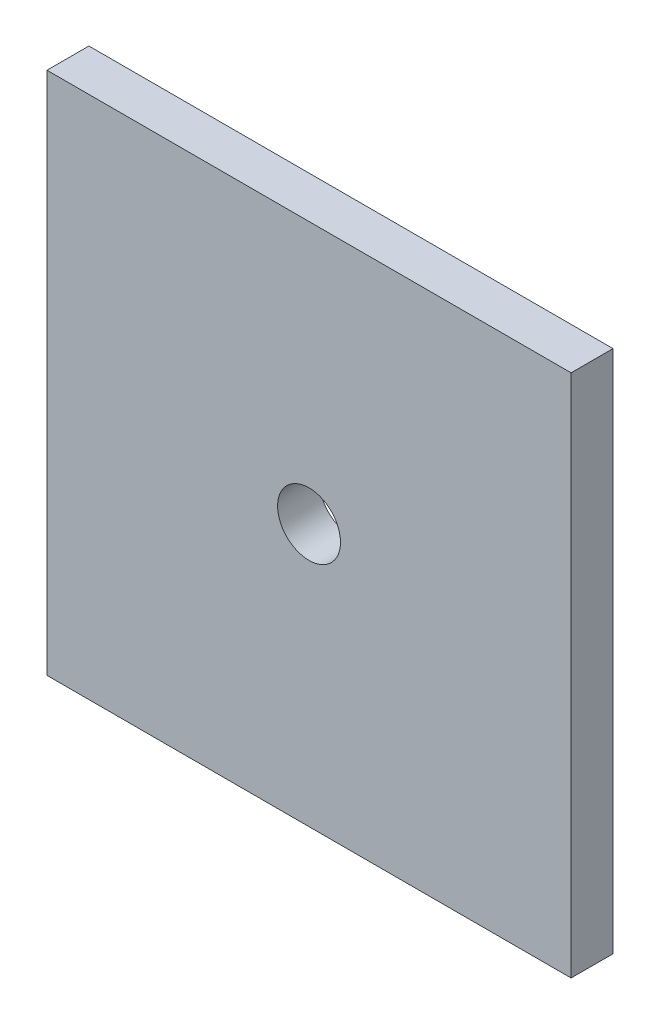
ISO-10303-21;
HEADER;
FILE_DESCRIPTION(('STEP AP214'),'2;1');
FILE_NAME('part.step','',(''),(''),'','','');
FILE_SCHEMA(('AUTOMOTIVE_DESIGN { 1 0 10303 214 1 1 1 1 }'));
ENDSEC;
DATA;
#1=APPLICATION_CONTEXT('core data for automotive mechanical design processes');
#2=APPLICATION_PROTOCOL_DEFINITION('international standard','automotive_design',2000,#1);
#3=PRODUCT_CONTEXT('',#1,'mechanical');
#4=PRODUCT('Part','Part','',(#3));
#5=PRODUCT_RELATED_PRODUCT_CATEGORY('part','',(#4));
#6=PRODUCT_DEFINITION_FORMATION('','',#4);
#7=PRODUCT_DEFINITION_CONTEXT('part definition',#1,'design');
#8=PRODUCT_DEFINITION('design','',#6,#7);
#9=PRODUCT_DEFINITION_SHAPE('','',#8);
#10=(LENGTH_UNIT() NAMED_UNIT(*) SI_UNIT(.MILLI.,.METRE.));
#11=(NAMED_UNIT(*) PLANE_ANGLE_UNIT() SI_UNIT($,.RADIAN.));
#12=(NAMED_UNIT(*) SI_UNIT($,.STERADIAN.) SOLID_ANGLE_UNIT());
#13=UNCERTAINTY_MEASURE_WITH_UNIT(LENGTH_MEASURE(1.E-05),#10,'distance_accuracy_value','');
#14=(GEOMETRIC_REPRESENTATION_CONTEXT(3) GLOBAL_UNCERTAINTY_ASSIGNED_CONTEXT((#13)) GLOBAL_UNIT_ASSIGNED_CONTEXT((#10,
#11,#12)) REPRESENTATION_CONTEXT('',''));
#15=CARTESIAN_POINT('',(0.,0.,0.));
#16=DIRECTION('',(0.,0.,1.));
#17=DIRECTION('',(1.,0.,0.));
#18=AXIS2_PLACEMENT_3D('',#15,#16,#17);
#19=CARTESIAN_POINT('',(0.,0.,3.));
#20=DIRECTION('',(0.,0.,-1.));
#21=DIRECTION('',(-1.,0.,0.));
#22=AXIS2_PLACEMENT_3D('',#19,#20,#21);
#23=PLANE('',#22);
#24=DIRECTION('',(0.,1.,0.));
#25=VECTOR('',#24,1.);
#26=CARTESIAN_POINT('',(18.75,-18.75,3.));
#27=LINE('',#26,#25);
#28=CARTESIAN_POINT('',(18.75,-18.75,3.));
#29=VERTEX_POINT('',#28);
#30=CARTESIAN_POINT('',(18.75,18.75,3.));
#31=VERTEX_POINT('',#30);
#32=EDGE_CURVE('E89',#29,#31,#27,.T.);
#33=ORIENTED_EDGE('',*,*,#32,.T.);
#34=DIRECTION('',(-1.,0.,0.));
#35=VECTOR('',#34,1.);
#36=CARTESIAN_POINT('',(-18.75,18.75,3.));
#37=LINE('',#36,#35);
#38=CARTESIAN_POINT('',(-18.75,18.75,3.));
#39=VERTEX_POINT('',#38);
#40=EDGE_CURVE('E84',#31,#39,#37,.T.);
#41=ORIENTED_EDGE('',*,*,#40,.T.);
#42=DIRECTION('',(0.,-1.,0.));
#43=VECTOR('',#42,1.);
#44=CARTESIAN_POINT('',(-18.75,-18.75,3.));
#45=LINE('',#44,#43);
#46=CARTESIAN_POINT('',(-18.75,-18.75,3.));
#47=VERTEX_POINT('',#46);
#48=EDGE_CURVE('E87',#39,#47,#45,.T.);
#49=ORIENTED_EDGE('',*,*,#48,.T.);
#50=DIRECTION('',(1.,0.,0.));
#51=VECTOR('',#50,1.);
#52=CARTESIAN_POINT('',(-18.75,-18.75,3.));
#53=LINE('',#52,#51);
#54=EDGE_CURVE('E54',#47,#29,#53,.T.);
#55=ORIENTED_EDGE('',*,*,#54,.T.);
#56=EDGE_LOOP('',(#33,#41,#49,#55));
#57=FACE_BOUND('',#56,.T.);
#58=CARTESIAN_POINT('',(0.,0.,3.));
#59=DIRECTION('',(0.,0.,1.));
#60=DIRECTION('',(1.,0.,0.));
#61=AXIS2_PLACEMENT_3D('',#58,#59,#60);
#62=CIRCLE('',#61,2.25);
#63=CARTESIAN_POINT('',(2.25,0.,3.));
#64=VERTEX_POINT('',#63);
#65=EDGE_CURVE('E104',#64,#64,#62,.T.);
#66=ORIENTED_EDGE('',*,*,#65,.F.);
#67=EDGE_LOOP('',(#66));
#68=FACE_BOUND('',#67,.T.);
#69=ADVANCED_FACE('F37',(#57,#68),#23,.F.);
#70=CARTESIAN_POINT('',(0.,0.,0.));
#71=DIRECTION('',(0.,0.,-1.));
#72=DIRECTION('',(-1.,0.,0.));
#73=AXIS2_PLACEMENT_3D('',#70,#71,#72);
#74=PLANE('',#73);
#75=DIRECTION('',(0.,1.,0.));
#76=VECTOR('',#75,1.);
#77=CARTESIAN_POINT('',(18.75,-18.75,0.));
#78=LINE('',#77,#76);
#79=CARTESIAN_POINT('',(18.75,-18.75,0.));
#80=VERTEX_POINT('',#79);
#81=CARTESIAN_POINT('',(18.75,18.75,0.));
#82=VERTEX_POINT('',#81);
#83=EDGE_CURVE('E101',#80,#82,#78,.T.);
#84=ORIENTED_EDGE('',*,*,#83,.F.);
#85=DIRECTION('',(1.,0.,0.));
#86=VECTOR('',#85,1.);
#87=CARTESIAN_POINT('',(-18.75,-18.75,0.));
#88=LINE('',#87,#86);
#89=CARTESIAN_POINT('',(-18.75,-18.75,0.));
#90=VERTEX_POINT('',#89);
#91=EDGE_CURVE('E77',#90,#80,#88,.T.);
#92=ORIENTED_EDGE('',*,*,#91,.F.);
#93=DIRECTION('',(0.,-1.,0.));
#94=VECTOR('',#93,1.);
#95=CARTESIAN_POINT('',(-18.75,-18.75,0.));
#96=LINE('',#95,#94);
#97=CARTESIAN_POINT('',(-18.75,18.75,0.));
#98=VERTEX_POINT('',#97);
#99=EDGE_CURVE('E71',#98,#90,#96,.T.);
#100=ORIENTED_EDGE('',*,*,#99,.F.);
#101=DIRECTION('',(-1.,0.,0.));
#102=VECTOR('',#101,1.);
#103=CARTESIAN_POINT('',(-18.75,18.75,0.));
#104=LINE('',#103,#102);
#105=EDGE_CURVE('E93',#82,#98,#104,.T.);
#106=ORIENTED_EDGE('',*,*,#105,.F.);
#107=EDGE_LOOP('',(#84,#92,#100,#106));
#108=FACE_BOUND('',#107,.T.);
#109=CARTESIAN_POINT('',(0.,0.,0.));
#110=DIRECTION('',(0.,0.,1.));
#111=DIRECTION('',(1.,0.,0.));
#112=AXIS2_PLACEMENT_3D('',#109,#110,#111);
#113=CIRCLE('',#112,2.25);
#114=CARTESIAN_POINT('',(2.25,0.,0.));
#115=VERTEX_POINT('',#114);
#116=EDGE_CURVE('E116',#115,#115,#113,.T.);
#117=ORIENTED_EDGE('',*,*,#116,.T.);
#118=EDGE_LOOP('',(#117));
#119=FACE_BOUND('',#118,.T.);
#120=ADVANCED_FACE('F112',(#108,#119),#74,.T.);
#121=CARTESIAN_POINT('',(18.75,-18.75,3.));
#122=DIRECTION('',(-1.,0.,0.));
#123=DIRECTION('',(0.,-1.,0.));
#124=AXIS2_PLACEMENT_3D('',#121,#122,#123);
#125=PLANE('',#124);
#126=ORIENTED_EDGE('',*,*,#83,.T.);
#127=DIRECTION('',(0.,0.,-1.));
#128=VECTOR('',#127,1.);
#129=CARTESIAN_POINT('',(18.75,18.75,3.));
#130=LINE('',#129,#128);
#131=EDGE_CURVE('E11',#31,#82,#130,.T.);
#132=ORIENTED_EDGE('',*,*,#131,.F.);
#133=ORIENTED_EDGE('',*,*,#32,.F.);
#134=DIRECTION('',(0.,0.,-1.));
#135=VECTOR('',#134,1.);
#136=CARTESIAN_POINT('',(18.75,-18.75,3.));
#137=LINE('',#136,#135);
#138=EDGE_CURVE('E97',#29,#80,#137,.T.);
#139=ORIENTED_EDGE('',*,*,#138,.T.);
#140=EDGE_LOOP('',(#126,#132,#133,#139));
#141=FACE_BOUND('',#140,.T.);
#142=ADVANCED_FACE('F39',(#141),#125,.F.);
#143=CARTESIAN_POINT('',(-18.75,18.75,3.));
#144=DIRECTION('',(0.,-1.,0.));
#145=DIRECTION('',(0.,0.,-1.));
#146=AXIS2_PLACEMENT_3D('',#143,#144,#145);
#147=PLANE('',#146);
#148=ORIENTED_EDGE('',*,*,#105,.T.);
#149=DIRECTION('',(0.,0.,-1.));
#150=VECTOR('',#149,1.);
#151=CARTESIAN_POINT('',(-18.75,18.75,3.));
#152=LINE('',#151,#150);
#153=EDGE_CURVE('E46',#39,#98,#152,.T.);
#154=ORIENTED_EDGE('',*,*,#153,.F.);
#155=ORIENTED_EDGE('',*,*,#40,.F.);
#156=ORIENTED_EDGE('',*,*,#131,.T.);
#157=EDGE_LOOP('',(#148,#154,#155,#156));
#158=FACE_BOUND('',#157,.T.);
#159=ADVANCED_FACE('F92',(#158),#147,.F.);
#160=CARTESIAN_POINT('',(-18.75,-18.75,3.));
#161=DIRECTION('',(1.,0.,0.));
#162=DIRECTION('',(0.,0.,-1.));
#163=AXIS2_PLACEMENT_3D('',#160,#161,#162);
#164=PLANE('',#163);
#165=ORIENTED_EDGE('',*,*,#99,.T.);
#166=DIRECTION('',(0.,0.,-1.));
#167=VECTOR('',#166,1.);
#168=CARTESIAN_POINT('',(-18.75,-18.75,3.));
#169=LINE('',#168,#167);
#170=EDGE_CURVE('E94',#47,#90,#169,.T.);
#171=ORIENTED_EDGE('',*,*,#170,.F.);
#172=ORIENTED_EDGE('',*,*,#48,.F.);
#173=ORIENTED_EDGE('',*,*,#153,.T.);
#174=EDGE_LOOP('',(#165,#171,#172,#173));
#175=FACE_BOUND('',#174,.T.);
#176=ADVANCED_FACE('F95',(#175),#164,.F.);
#177=CARTESIAN_POINT('',(-18.75,-18.75,3.));
#178=DIRECTION('',(0.,1.,0.));
#179=DIRECTION('',(0.,0.,1.));
#180=AXIS2_PLACEMENT_3D('',#177,#178,#179);
#181=PLANE('',#180);
#182=ORIENTED_EDGE('',*,*,#91,.T.);
#183=ORIENTED_EDGE('',*,*,#138,.F.);
#184=ORIENTED_EDGE('',*,*,#54,.F.);
#185=ORIENTED_EDGE('',*,*,#170,.T.);
#186=EDGE_LOOP('',(#182,#183,#184,#185));
#187=FACE_BOUND('',#186,.T.);
#188=ADVANCED_FACE('F109',(#187),#181,.F.);
#189=CARTESIAN_POINT('',(0.,0.,3.));
#190=DIRECTION('',(0.,0.,-1.));
#191=DIRECTION('',(-1.,0.,0.));
#192=AXIS2_PLACEMENT_3D('',#189,#190,#191);
#193=CYLINDRICAL_SURFACE('',#192,2.25);
#194=ORIENTED_EDGE('',*,*,#65,.T.);
#195=EDGE_LOOP('',(#194));
#196=FACE_BOUND('',#195,.T.);
#197=ORIENTED_EDGE('',*,*,#116,.F.);
#198=EDGE_LOOP('',(#197));
#199=FACE_BOUND('',#198,.T.);
#200=ADVANCED_FACE('F122',(#196,#199),#193,.F.);
#201=CLOSED_SHELL('',(#69,#120,#142,#159,#176,#188,#200));
#202=MANIFOLD_SOLID_BREP('B2',#201);
#203=ADVANCED_BREP_SHAPE_REPRESENTATION('',(#18,#202),#14);
#204=SHAPE_DEFINITION_REPRESENTATION(#9,#203);
ENDSEC;
END-ISO-10303-21;
